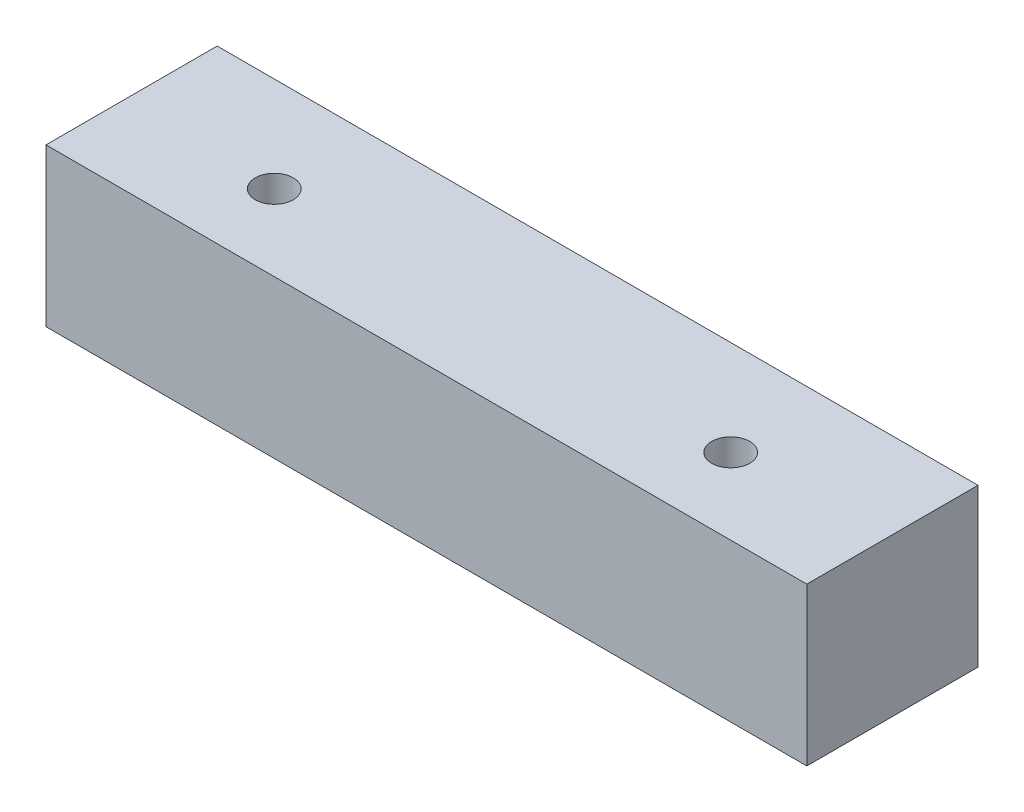
ISO-10303-21;
HEADER;
FILE_DESCRIPTION(('STEP AP214'),'2;1');
FILE_NAME('part.step','',(''),(''),'','','');
FILE_SCHEMA(('AUTOMOTIVE_DESIGN { 1 0 10303 214 1 1 1 1 }'));
ENDSEC;
DATA;
#1=APPLICATION_CONTEXT('core data for automotive mechanical design processes');
#2=APPLICATION_PROTOCOL_DEFINITION('international standard','automotive_design',2000,#1);
#3=PRODUCT_CONTEXT('',#1,'mechanical');
#4=PRODUCT('Part','Part','',(#3));
#5=PRODUCT_RELATED_PRODUCT_CATEGORY('part','',(#4));
#6=PRODUCT_DEFINITION_FORMATION('','',#4);
#7=PRODUCT_DEFINITION_CONTEXT('part definition',#1,'design');
#8=PRODUCT_DEFINITION('design','',#6,#7);
#9=PRODUCT_DEFINITION_SHAPE('','',#8);
#10=(LENGTH_UNIT() NAMED_UNIT(*) SI_UNIT(.MILLI.,.METRE.));
#11=(NAMED_UNIT(*) PLANE_ANGLE_UNIT() SI_UNIT($,.RADIAN.));
#12=(NAMED_UNIT(*) SI_UNIT($,.STERADIAN.) SOLID_ANGLE_UNIT());
#13=UNCERTAINTY_MEASURE_WITH_UNIT(LENGTH_MEASURE(1.E-05),#10,'distance_accuracy_value','');
#14=(GEOMETRIC_REPRESENTATION_CONTEXT(3) GLOBAL_UNCERTAINTY_ASSIGNED_CONTEXT((#13)) GLOBAL_UNIT_ASSIGNED_CONTEXT((#10,
#11,#12)) REPRESENTATION_CONTEXT('',''));
#15=CARTESIAN_POINT('',(0.,0.,0.));
#16=DIRECTION('',(0.,0.,1.));
#17=DIRECTION('',(1.,0.,0.));
#18=AXIS2_PLACEMENT_3D('',#15,#16,#17);
#19=CARTESIAN_POINT('',(8.,4.78,-5.2));
#20=DIRECTION('',(0.,0.,-1.));
#21=DIRECTION('',(-1.,0.,0.));
#22=AXIS2_PLACEMENT_3D('',#19,#20,#21);
#23=PLANE('',#22);
#24=DIRECTION('',(1.,0.,0.));
#25=VECTOR('',#24,1.);
#26=CARTESIAN_POINT('',(9.75,5.03,-5.2));
#27=LINE('',#26,#25);
#28=CARTESIAN_POINT('',(6.26794919243112,5.03,-5.2));
#29=VERTEX_POINT('',#28);
#30=CARTESIAN_POINT('',(9.73205080756888,5.03,-5.2));
#31=VERTEX_POINT('',#30);
#32=EDGE_CURVE('E216',#29,#31,#27,.T.);
#33=ORIENTED_EDGE('',*,*,#32,.F.);
#34=CARTESIAN_POINT('',(8.,4.78,-5.2));
#35=DIRECTION('',(0.,0.,-1.));
#36=DIRECTION('',(-1.,0.,0.));
#37=AXIS2_PLACEMENT_3D('',#34,#35,#36);
#38=CIRCLE('',#37,1.75);
#39=EDGE_CURVE('E301',#29,#31,#38,.T.);
#40=ORIENTED_EDGE('',*,*,#39,.T.);
#41=EDGE_LOOP('',(#33,#40));
#42=FACE_BOUND('',#41,.T.);
#43=ADVANCED_FACE('F43',(#42),#23,.T.);
#44=CARTESIAN_POINT('',(32.,4.78,-5.2));
#45=DIRECTION('',(0.,0.,-1.));
#46=DIRECTION('',(-1.,0.,0.));
#47=AXIS2_PLACEMENT_3D('',#44,#45,#46);
#48=PLANE('',#47);
#49=DIRECTION('',(-1.,0.,0.));
#50=VECTOR('',#49,1.);
#51=CARTESIAN_POINT('',(34.25,4.53,-5.2));
#52=LINE('',#51,#50);
#53=CARTESIAN_POINT('',(33.7320508075689,4.53,-5.2));
#54=VERTEX_POINT('',#53);
#55=CARTESIAN_POINT('',(30.2679491924311,4.53,-5.2));
#56=VERTEX_POINT('',#55);
#57=EDGE_CURVE('E264',#54,#56,#52,.T.);
#58=ORIENTED_EDGE('',*,*,#57,.F.);
#59=CARTESIAN_POINT('',(32.,4.78,-5.2));
#60=DIRECTION('',(0.,0.,-1.));
#61=DIRECTION('',(-1.,0.,0.));
#62=AXIS2_PLACEMENT_3D('',#59,#60,#61);
#63=CIRCLE('',#62,1.75);
#64=EDGE_CURVE('E434',#54,#56,#63,.T.);
#65=ORIENTED_EDGE('',*,*,#64,.T.);
#66=EDGE_LOOP('',(#58,#65));
#67=FACE_BOUND('',#66,.T.);
#68=ADVANCED_FACE('F491',(#67),#48,.T.);
#69=CARTESIAN_POINT('',(8.,-1.72,-4.));
#70=DIRECTION('',(0.,1.,0.));
#71=DIRECTION('',(0.,0.,1.));
#72=AXIS2_PLACEMENT_3D('',#69,#70,#71);
#73=CYLINDRICAL_SURFACE('',#72,1.);
#74=CARTESIAN_POINT('',(8.,5.03,-4.));
#75=DIRECTION('',(0.,1.,0.));
#76=DIRECTION('',(0.,0.,1.));
#77=AXIS2_PLACEMENT_3D('',#74,#75,#76);
#78=CIRCLE('',#77,1.);
#79=CARTESIAN_POINT('',(8.,5.03,-3.));
#80=VERTEX_POINT('',#79);
#81=EDGE_CURVE('E47',#80,#80,#78,.F.);
#82=ORIENTED_EDGE('',*,*,#81,.T.);
#83=EDGE_LOOP('',(#82));
#84=FACE_BOUND('',#83,.T.);
#85=CARTESIAN_POINT('',(8.,8.28,-4.));
#86=DIRECTION('',(0.,-1.,0.));
#87=DIRECTION('',(0.,0.,-1.));
#88=AXIS2_PLACEMENT_3D('',#85,#86,#87);
#89=CIRCLE('',#88,1.);
#90=CARTESIAN_POINT('',(8.,8.28,-5.));
#91=VERTEX_POINT('',#90);
#92=EDGE_CURVE('E303',#91,#91,#89,.T.);
#93=ORIENTED_EDGE('',*,*,#92,.F.);
#94=EDGE_LOOP('',(#93));
#95=FACE_BOUND('',#94,.T.);
#96=ADVANCED_FACE('F496',(#84,#95),#73,.F.);
#97=CARTESIAN_POINT('',(32.,-1.72,-4.));
#98=DIRECTION('',(0.,1.,0.));
#99=DIRECTION('',(0.,0.,1.));
#100=AXIS2_PLACEMENT_3D('',#97,#98,#99);
#101=CYLINDRICAL_SURFACE('',#100,0.999999999999998);
#102=CARTESIAN_POINT('',(32.,5.03,-4.));
#103=DIRECTION('',(0.,1.,0.));
#104=DIRECTION('',(0.,0.,1.));
#105=AXIS2_PLACEMENT_3D('',#102,#103,#104);
#106=CIRCLE('',#105,0.999999999999998);
#107=CARTESIAN_POINT('',(32.,5.03,-3.));
#108=VERTEX_POINT('',#107);
#109=EDGE_CURVE('E358',#108,#108,#106,.F.);
#110=ORIENTED_EDGE('',*,*,#109,.T.);
#111=EDGE_LOOP('',(#110));
#112=FACE_BOUND('',#111,.T.);
#113=CARTESIAN_POINT('',(32.,8.28,-4.));
#114=DIRECTION('',(0.,-1.,0.));
#115=DIRECTION('',(0.,0.,-1.));
#116=AXIS2_PLACEMENT_3D('',#113,#114,#115);
#117=CIRCLE('',#116,0.999999999999998);
#118=CARTESIAN_POINT('',(32.,8.28,-5.));
#119=VERTEX_POINT('',#118);
#120=EDGE_CURVE('E308',#119,#119,#117,.T.);
#121=ORIENTED_EDGE('',*,*,#120,.F.);
#122=EDGE_LOOP('',(#121));
#123=FACE_BOUND('',#122,.T.);
#124=ADVANCED_FACE('F489',(#112,#123),#101,.F.);
#125=CARTESIAN_POINT('',(0.,8.28,0.));
#126=DIRECTION('',(0.,0.,-1.));
#127=DIRECTION('',(-1.,0.,0.));
#128=AXIS2_PLACEMENT_3D('',#125,#126,#127);
#129=PLANE('',#128);
#130=DIRECTION('',(1.,0.,0.));
#131=VECTOR('',#130,1.);
#132=CARTESIAN_POINT('',(0.,0.,0.));
#133=LINE('',#132,#131);
#134=CARTESIAN_POINT('',(0.,0.,0.));
#135=VERTEX_POINT('',#134);
#136=CARTESIAN_POINT('',(40.,0.,0.));
#137=VERTEX_POINT('',#136);
#138=EDGE_CURVE('E312',#135,#137,#133,.T.);
#139=ORIENTED_EDGE('',*,*,#138,.T.);
#140=DIRECTION('',(0.,-1.,0.));
#141=VECTOR('',#140,1.);
#142=CARTESIAN_POINT('',(40.,8.28,0.));
#143=LINE('',#142,#141);
#144=CARTESIAN_POINT('',(40.,8.28,0.));
#145=VERTEX_POINT('',#144);
#146=EDGE_CURVE('E11',#145,#137,#143,.T.);
#147=ORIENTED_EDGE('',*,*,#146,.F.);
#148=DIRECTION('',(1.,0.,0.));
#149=VECTOR('',#148,1.);
#150=CARTESIAN_POINT('',(0.,8.28,0.));
#151=LINE('',#150,#149);
#152=CARTESIAN_POINT('',(0.,8.28,0.));
#153=VERTEX_POINT('',#152);
#154=EDGE_CURVE('E313',#153,#145,#151,.T.);
#155=ORIENTED_EDGE('',*,*,#154,.F.);
#156=DIRECTION('',(0.,-1.,0.));
#157=VECTOR('',#156,1.);
#158=CARTESIAN_POINT('',(0.,8.28,0.));
#159=LINE('',#158,#157);
#160=EDGE_CURVE('E327',#153,#135,#159,.T.);
#161=ORIENTED_EDGE('',*,*,#160,.T.);
#162=EDGE_LOOP('',(#139,#147,#155,#161));
#163=FACE_BOUND('',#162,.T.);
#164=ADVANCED_FACE('F45',(#163),#129,.F.);
#165=CARTESIAN_POINT('',(40.,8.28,-9.));
#166=DIRECTION('',(-1.,0.,0.));
#167=DIRECTION('',(0.,0.,1.));
#168=AXIS2_PLACEMENT_3D('',#165,#166,#167);
#169=PLANE('',#168);
#170=DIRECTION('',(0.,0.,-1.));
#171=VECTOR('',#170,1.);
#172=CARTESIAN_POINT('',(40.,0.,-9.));
#173=LINE('',#172,#171);
#174=CARTESIAN_POINT('',(40.,0.,-9.));
#175=VERTEX_POINT('',#174);
#176=EDGE_CURVE('E331',#137,#175,#173,.T.);
#177=ORIENTED_EDGE('',*,*,#176,.T.);
#178=DIRECTION('',(0.,-1.,0.));
#179=VECTOR('',#178,1.);
#180=CARTESIAN_POINT('',(40.,8.28,-9.));
#181=LINE('',#180,#179);
#182=CARTESIAN_POINT('',(40.,8.28,-9.));
#183=VERTEX_POINT('',#182);
#184=EDGE_CURVE('E53',#183,#175,#181,.T.);
#185=ORIENTED_EDGE('',*,*,#184,.F.);
#186=DIRECTION('',(0.,0.,-1.));
#187=VECTOR('',#186,1.);
#188=CARTESIAN_POINT('',(40.,8.28,-9.));
#189=LINE('',#188,#187);
#190=EDGE_CURVE('E317',#145,#183,#189,.T.);
#191=ORIENTED_EDGE('',*,*,#190,.F.);
#192=ORIENTED_EDGE('',*,*,#146,.T.);
#193=EDGE_LOOP('',(#177,#185,#191,#192));
#194=FACE_BOUND('',#193,.T.);
#195=ADVANCED_FACE('F464',(#194),#169,.F.);
#196=CARTESIAN_POINT('',(0.,8.28,-9.));
#197=DIRECTION('',(0.,0.,1.));
#198=DIRECTION('',(1.,0.,0.));
#199=AXIS2_PLACEMENT_3D('',#196,#197,#198);
#200=PLANE('',#199);
#201=CARTESIAN_POINT('',(32.,4.78,-9.));
#202=DIRECTION('',(0.,0.,-1.));
#203=DIRECTION('',(-1.,0.,0.));
#204=AXIS2_PLACEMENT_3D('',#201,#202,#203);
#205=CIRCLE('',#204,1.75);
#206=CARTESIAN_POINT('',(30.25,4.78,-9.));
#207=VERTEX_POINT('',#206);
#208=EDGE_CURVE('E290',#207,#207,#205,.T.);
#209=ORIENTED_EDGE('',*,*,#208,.F.);
#210=EDGE_LOOP('',(#209));
#211=FACE_BOUND('',#210,.T.);
#212=CARTESIAN_POINT('',(8.,4.78,-9.));
#213=DIRECTION('',(0.,0.,-1.));
#214=DIRECTION('',(-1.,0.,0.));
#215=AXIS2_PLACEMENT_3D('',#212,#213,#214);
#216=CIRCLE('',#215,1.75);
#217=CARTESIAN_POINT('',(6.25,4.78,-9.));
#218=VERTEX_POINT('',#217);
#219=EDGE_CURVE('E294',#218,#218,#216,.T.);
#220=ORIENTED_EDGE('',*,*,#219,.F.);
#221=EDGE_LOOP('',(#220));
#222=FACE_BOUND('',#221,.T.);
#223=DIRECTION('',(-1.,0.,0.));
#224=VECTOR('',#223,1.);
#225=CARTESIAN_POINT('',(0.,0.,-9.));
#226=LINE('',#225,#224);
#227=CARTESIAN_POINT('',(0.,0.,-9.));
#228=VERTEX_POINT('',#227);
#229=EDGE_CURVE('E334',#175,#228,#226,.T.);
#230=ORIENTED_EDGE('',*,*,#229,.T.);
#231=DIRECTION('',(0.,-1.,0.));
#232=VECTOR('',#231,1.);
#233=CARTESIAN_POINT('',(0.,8.28,-9.));
#234=LINE('',#233,#232);
#235=CARTESIAN_POINT('',(0.,8.28,-9.));
#236=VERTEX_POINT('',#235);
#237=EDGE_CURVE('E342',#236,#228,#234,.T.);
#238=ORIENTED_EDGE('',*,*,#237,.F.);
#239=DIRECTION('',(-1.,0.,0.));
#240=VECTOR('',#239,1.);
#241=CARTESIAN_POINT('',(0.,8.28,-9.));
#242=LINE('',#241,#240);
#243=EDGE_CURVE('E321',#183,#236,#242,.T.);
#244=ORIENTED_EDGE('',*,*,#243,.F.);
#245=ORIENTED_EDGE('',*,*,#184,.T.);
#246=EDGE_LOOP('',(#230,#238,#244,#245));
#247=FACE_BOUND('',#246,.T.);
#248=ADVANCED_FACE('F460',(#211,#222,#247),#200,.F.);
#249=CARTESIAN_POINT('',(0.,8.28,0.));
#250=DIRECTION('',(1.,0.,0.));
#251=DIRECTION('',(0.,0.,-1.));
#252=AXIS2_PLACEMENT_3D('',#249,#250,#251);
#253=PLANE('',#252);
#254=DIRECTION('',(0.,0.,1.));
#255=VECTOR('',#254,1.);
#256=CARTESIAN_POINT('',(0.,0.,0.));
#257=LINE('',#256,#255);
#258=EDGE_CURVE('E318',#228,#135,#257,.T.);
#259=ORIENTED_EDGE('',*,*,#258,.T.);
#260=ORIENTED_EDGE('',*,*,#160,.F.);
#261=DIRECTION('',(0.,0.,1.));
#262=VECTOR('',#261,1.);
#263=CARTESIAN_POINT('',(0.,8.28,0.));
#264=LINE('',#263,#262);
#265=EDGE_CURVE('E324',#236,#153,#264,.T.);
#266=ORIENTED_EDGE('',*,*,#265,.F.);
#267=ORIENTED_EDGE('',*,*,#237,.T.);
#268=EDGE_LOOP('',(#259,#260,#266,#267));
#269=FACE_BOUND('',#268,.T.);
#270=ADVANCED_FACE('F463',(#269),#253,.F.);
#271=CARTESIAN_POINT('',(0.,8.28,0.));
#272=DIRECTION('',(0.,-1.,0.));
#273=DIRECTION('',(0.,0.,-1.));
#274=AXIS2_PLACEMENT_3D('',#271,#272,#273);
#275=PLANE('',#274);
#276=ORIENTED_EDGE('',*,*,#120,.T.);
#277=EDGE_LOOP('',(#276));
#278=FACE_BOUND('',#277,.T.);
#279=ORIENTED_EDGE('',*,*,#92,.T.);
#280=EDGE_LOOP('',(#279));
#281=FACE_BOUND('',#280,.T.);
#282=ORIENTED_EDGE('',*,*,#154,.T.);
#283=ORIENTED_EDGE('',*,*,#190,.T.);
#284=ORIENTED_EDGE('',*,*,#243,.T.);
#285=ORIENTED_EDGE('',*,*,#265,.T.);
#286=EDGE_LOOP('',(#282,#283,#284,#285));
#287=FACE_BOUND('',#286,.T.);
#288=ADVANCED_FACE('F483',(#278,#281,#287),#275,.F.);
#289=CARTESIAN_POINT('',(0.,0.,0.));
#290=DIRECTION('',(0.,-1.,0.));
#291=DIRECTION('',(0.,0.,-1.));
#292=AXIS2_PLACEMENT_3D('',#289,#290,#291);
#293=PLANE('',#292);
#294=CARTESIAN_POINT('',(32.,0.,-4.));
#295=DIRECTION('',(0.,-1.,0.));
#296=DIRECTION('',(0.,0.,-1.));
#297=AXIS2_PLACEMENT_3D('',#294,#295,#296);
#298=CIRCLE('',#297,0.999999999999998);
#299=CARTESIAN_POINT('',(32.,0.,-5.));
#300=VERTEX_POINT('',#299);
#301=EDGE_CURVE('E307',#300,#300,#298,.T.);
#302=ORIENTED_EDGE('',*,*,#301,.F.);
#303=EDGE_LOOP('',(#302));
#304=FACE_BOUND('',#303,.T.);
#305=CARTESIAN_POINT('',(8.,0.,-4.));
#306=DIRECTION('',(0.,-1.,0.));
#307=DIRECTION('',(0.,0.,-1.));
#308=AXIS2_PLACEMENT_3D('',#305,#306,#307);
#309=CIRCLE('',#308,1.);
#310=CARTESIAN_POINT('',(8.,0.,-5.));
#311=VERTEX_POINT('',#310);
#312=EDGE_CURVE('E287',#311,#311,#309,.T.);
#313=ORIENTED_EDGE('',*,*,#312,.F.);
#314=EDGE_LOOP('',(#313));
#315=FACE_BOUND('',#314,.T.);
#316=ORIENTED_EDGE('',*,*,#138,.F.);
#317=ORIENTED_EDGE('',*,*,#258,.F.);
#318=ORIENTED_EDGE('',*,*,#229,.F.);
#319=ORIENTED_EDGE('',*,*,#176,.F.);
#320=EDGE_LOOP('',(#316,#317,#318,#319));
#321=FACE_BOUND('',#320,.T.);
#322=ADVANCED_FACE('F478',(#304,#315,#321),#293,.T.);
#323=CARTESIAN_POINT('',(8.,4.53,-4.));
#324=DIRECTION('',(0.,-1.,0.));
#325=DIRECTION('',(0.,0.,-1.));
#326=AXIS2_PLACEMENT_3D('',#323,#324,#325);
#327=CIRCLE('',#326,1.);
#328=CARTESIAN_POINT('',(8.,4.53,-5.));
#329=VERTEX_POINT('',#328);
#330=EDGE_CURVE('E361',#329,#329,#327,.F.);
#331=ORIENTED_EDGE('',*,*,#330,.T.);
#332=EDGE_LOOP('',(#331));
#333=FACE_BOUND('',#332,.T.);
#334=ORIENTED_EDGE('',*,*,#312,.T.);
#335=EDGE_LOOP('',(#334));
#336=FACE_BOUND('',#335,.T.);
#337=ADVANCED_FACE('F612',(#333,#336),#73,.F.);
#338=CARTESIAN_POINT('',(32.,4.53,-4.));
#339=DIRECTION('',(0.,-1.,0.));
#340=DIRECTION('',(0.,0.,-1.));
#341=AXIS2_PLACEMENT_3D('',#338,#339,#340);
#342=CIRCLE('',#341,0.999999999999998);
#343=CARTESIAN_POINT('',(32.,4.53,-5.));
#344=VERTEX_POINT('',#343);
#345=EDGE_CURVE('E227',#344,#344,#342,.F.);
#346=ORIENTED_EDGE('',*,*,#345,.T.);
#347=EDGE_LOOP('',(#346));
#348=FACE_BOUND('',#347,.T.);
#349=ORIENTED_EDGE('',*,*,#301,.T.);
#350=EDGE_LOOP('',(#349));
#351=FACE_BOUND('',#350,.T.);
#352=ADVANCED_FACE('F504',(#348,#351),#101,.F.);
#353=CARTESIAN_POINT('',(8.,4.78,-5.2));
#354=DIRECTION('',(0.,0.,-1.));
#355=DIRECTION('',(-1.,0.,0.));
#356=AXIS2_PLACEMENT_3D('',#353,#354,#355);
#357=CYLINDRICAL_SURFACE('',#356,1.75);
#358=CARTESIAN_POINT('',(6.25,4.78,-5.2));
#359=VERTEX_POINT('',#358);
#360=EDGE_CURVE('E298',#359,#29,#38,.T.);
#361=ORIENTED_EDGE('',*,*,#360,.F.);
#362=CARTESIAN_POINT('',(6.26794919243112,4.53,-5.2));
#363=VERTEX_POINT('',#362);
#364=EDGE_CURVE('E302',#363,#359,#38,.T.);
#365=ORIENTED_EDGE('',*,*,#364,.F.);
#366=CARTESIAN_POINT('',(9.73205080756888,4.53,-5.2));
#367=VERTEX_POINT('',#366);
#368=EDGE_CURVE('E371',#367,#363,#38,.T.);
#369=ORIENTED_EDGE('',*,*,#368,.F.);
#370=CARTESIAN_POINT('',(9.75,4.78,-5.2));
#371=VERTEX_POINT('',#370);
#372=EDGE_CURVE('E378',#371,#367,#38,.T.);
#373=ORIENTED_EDGE('',*,*,#372,.F.);
#374=EDGE_CURVE('E383',#31,#371,#38,.T.);
#375=ORIENTED_EDGE('',*,*,#374,.F.);
#376=ORIENTED_EDGE('',*,*,#39,.F.);
#377=EDGE_LOOP('',(#361,#365,#369,#373,#375,#376));
#378=FACE_BOUND('',#377,.T.);
#379=ORIENTED_EDGE('',*,*,#219,.T.);
#380=EDGE_LOOP('',(#379));
#381=FACE_BOUND('',#380,.T.);
#382=ADVANCED_FACE('F397',(#378,#381),#357,.F.);
#383=DIRECTION('',(-1.,0.,0.));
#384=VECTOR('',#383,1.);
#385=CARTESIAN_POINT('',(6.25,4.53,-5.2));
#386=LINE('',#385,#384);
#387=EDGE_CURVE('E222',#367,#363,#386,.T.);
#388=ORIENTED_EDGE('',*,*,#387,.F.);
#389=ORIENTED_EDGE('',*,*,#368,.T.);
#390=EDGE_LOOP('',(#388,#389));
#391=FACE_BOUND('',#390,.T.);
#392=ADVANCED_FACE('F456',(#391),#23,.T.);
#393=CARTESIAN_POINT('',(32.,4.78,-5.2));
#394=DIRECTION('',(0.,0.,-1.));
#395=DIRECTION('',(-1.,0.,0.));
#396=AXIS2_PLACEMENT_3D('',#393,#394,#395);
#397=CYLINDRICAL_SURFACE('',#396,1.75);
#398=CARTESIAN_POINT('',(30.25,4.78,-5.2));
#399=VERTEX_POINT('',#398);
#400=CARTESIAN_POINT('',(30.2679491924311,5.03,-5.2));
#401=VERTEX_POINT('',#400);
#402=EDGE_CURVE('E284',#399,#401,#63,.T.);
#403=ORIENTED_EDGE('',*,*,#402,.F.);
#404=EDGE_CURVE('E289',#56,#399,#63,.T.);
#405=ORIENTED_EDGE('',*,*,#404,.F.);
#406=ORIENTED_EDGE('',*,*,#64,.F.);
#407=CARTESIAN_POINT('',(33.75,4.78,-5.2));
#408=VERTEX_POINT('',#407);
#409=EDGE_CURVE('E432',#408,#54,#63,.T.);
#410=ORIENTED_EDGE('',*,*,#409,.F.);
#411=EDGE_CURVE('E288',#401,#408,#63,.T.);
#412=ORIENTED_EDGE('',*,*,#411,.F.);
#413=EDGE_LOOP('',(#403,#405,#406,#410,#412));
#414=FACE_BOUND('',#413,.T.);
#415=ORIENTED_EDGE('',*,*,#208,.T.);
#416=EDGE_LOOP('',(#415));
#417=FACE_BOUND('',#416,.T.);
#418=ADVANCED_FACE('F453',(#414,#417),#397,.F.);
#419=DIRECTION('',(0.894427190999916,-0.447213595499958,0.));
#420=VECTOR('',#419,1.);
#421=CARTESIAN_POINT('',(34.25,4.53,-5.2));
#422=LINE('',#421,#420);
#423=CARTESIAN_POINT('',(33.25,5.03,-5.2));
#424=VERTEX_POINT('',#423);
#425=EDGE_CURVE('E265',#424,#408,#422,.T.);
#426=ORIENTED_EDGE('',*,*,#425,.F.);
#427=DIRECTION('',(1.,0.,0.));
#428=VECTOR('',#427,1.);
#429=CARTESIAN_POINT('',(30.25,5.03,-5.2));
#430=LINE('',#429,#428);
#431=EDGE_CURVE('E253',#401,#424,#430,.T.);
#432=ORIENTED_EDGE('',*,*,#431,.F.);
#433=ORIENTED_EDGE('',*,*,#411,.T.);
#434=EDGE_LOOP('',(#426,#432,#433));
#435=FACE_BOUND('',#434,.T.);
#436=ADVANCED_FACE('F428',(#435),#48,.T.);
#437=CARTESIAN_POINT('',(0.,0.,-5.2));
#438=DIRECTION('',(0.,0.,-1.));
#439=DIRECTION('',(-1.,0.,0.));
#440=AXIS2_PLACEMENT_3D('',#437,#438,#439);
#441=PLANE('',#440);
#442=ORIENTED_EDGE('',*,*,#409,.T.);
#443=CARTESIAN_POINT('',(34.25,4.53,-5.2));
#444=VERTEX_POINT('',#443);
#445=EDGE_CURVE('E259',#444,#54,#52,.T.);
#446=ORIENTED_EDGE('',*,*,#445,.F.);
#447=EDGE_CURVE('E263',#408,#444,#422,.T.);
#448=ORIENTED_EDGE('',*,*,#447,.F.);
#449=EDGE_LOOP('',(#442,#446,#448));
#450=FACE_BOUND('',#449,.T.);
#451=ADVANCED_FACE('F538',(#450),#441,.F.);
#452=ORIENTED_EDGE('',*,*,#402,.T.);
#453=CARTESIAN_POINT('',(30.25,5.03,-5.2));
#454=VERTEX_POINT('',#453);
#455=EDGE_CURVE('E69',#454,#401,#430,.T.);
#456=ORIENTED_EDGE('',*,*,#455,.F.);
#457=DIRECTION('',(0.,1.,0.));
#458=VECTOR('',#457,1.);
#459=CARTESIAN_POINT('',(30.25,4.53,-5.2));
#460=LINE('',#459,#458);
#461=EDGE_CURVE('E252',#399,#454,#460,.T.);
#462=ORIENTED_EDGE('',*,*,#461,.F.);
#463=EDGE_LOOP('',(#452,#456,#462));
#464=FACE_BOUND('',#463,.T.);
#465=ADVANCED_FACE('F449',(#464),#441,.F.);
#466=CARTESIAN_POINT('',(30.25,5.03,-2.7));
#467=DIRECTION('',(0.,1.,0.));
#468=DIRECTION('',(0.,0.,1.));
#469=AXIS2_PLACEMENT_3D('',#466,#467,#468);
#470=PLANE('',#469);
#471=ORIENTED_EDGE('',*,*,#455,.T.);
#472=ORIENTED_EDGE('',*,*,#431,.T.);
#473=DIRECTION('',(0.,0.,-1.));
#474=VECTOR('',#473,1.);
#475=CARTESIAN_POINT('',(33.25,5.03,-2.7));
#476=LINE('',#475,#474);
#477=CARTESIAN_POINT('',(33.25,5.03,-2.7));
#478=VERTEX_POINT('',#477);
#479=EDGE_CURVE('E246',#478,#424,#476,.T.);
#480=ORIENTED_EDGE('',*,*,#479,.F.);
#481=DIRECTION('',(1.,0.,0.));
#482=VECTOR('',#481,1.);
#483=CARTESIAN_POINT('',(30.25,5.03,-2.7));
#484=LINE('',#483,#482);
#485=CARTESIAN_POINT('',(30.25,5.03,-2.7));
#486=VERTEX_POINT('',#485);
#487=EDGE_CURVE('E238',#486,#478,#484,.T.);
#488=ORIENTED_EDGE('',*,*,#487,.F.);
#489=DIRECTION('',(0.,0.,-1.));
#490=VECTOR('',#489,1.);
#491=CARTESIAN_POINT('',(30.25,5.03,-2.7));
#492=LINE('',#491,#490);
#493=EDGE_CURVE('E243',#486,#454,#492,.T.);
#494=ORIENTED_EDGE('',*,*,#493,.T.);
#495=EDGE_LOOP('',(#471,#472,#480,#488,#494));
#496=FACE_BOUND('',#495,.T.);
#497=ORIENTED_EDGE('',*,*,#109,.F.);
#498=EDGE_LOOP('',(#497));
#499=FACE_BOUND('',#498,.T.);
#500=ADVANCED_FACE('F417',(#496,#499),#470,.F.);
#501=CARTESIAN_POINT('',(34.25,4.53,-2.7));
#502=DIRECTION('',(0.,-1.,0.));
#503=DIRECTION('',(0.,0.,-1.));
#504=AXIS2_PLACEMENT_3D('',#501,#502,#503);
#505=PLANE('',#504);
#506=ORIENTED_EDGE('',*,*,#445,.T.);
#507=ORIENTED_EDGE('',*,*,#57,.T.);
#508=CARTESIAN_POINT('',(30.25,4.53,-5.2));
#509=VERTEX_POINT('',#508);
#510=EDGE_CURVE('E258',#56,#509,#52,.T.);
#511=ORIENTED_EDGE('',*,*,#510,.T.);
#512=DIRECTION('',(0.,0.,-1.));
#513=VECTOR('',#512,1.);
#514=CARTESIAN_POINT('',(30.25,4.53,-2.7));
#515=LINE('',#514,#513);
#516=CARTESIAN_POINT('',(30.25,4.53,-2.7));
#517=VERTEX_POINT('',#516);
#518=EDGE_CURVE('E239',#517,#509,#515,.T.);
#519=ORIENTED_EDGE('',*,*,#518,.F.);
#520=DIRECTION('',(-1.,0.,0.));
#521=VECTOR('',#520,1.);
#522=CARTESIAN_POINT('',(34.25,4.53,-2.7));
#523=LINE('',#522,#521);
#524=CARTESIAN_POINT('',(34.25,4.53,-2.7));
#525=VERTEX_POINT('',#524);
#526=EDGE_CURVE('E276',#525,#517,#523,.T.);
#527=ORIENTED_EDGE('',*,*,#526,.F.);
#528=DIRECTION('',(0.,0.,-1.));
#529=VECTOR('',#528,1.);
#530=CARTESIAN_POINT('',(34.25,4.53,-2.7));
#531=LINE('',#530,#529);
#532=EDGE_CURVE('E234',#525,#444,#531,.T.);
#533=ORIENTED_EDGE('',*,*,#532,.T.);
#534=EDGE_LOOP('',(#506,#507,#511,#519,#527,#533));
#535=FACE_BOUND('',#534,.T.);
#536=ORIENTED_EDGE('',*,*,#345,.F.);
#537=EDGE_LOOP('',(#536));
#538=FACE_BOUND('',#537,.T.);
#539=ADVANCED_FACE('F557',(#535,#538),#505,.F.);
#540=CARTESIAN_POINT('',(34.25,4.53,-2.7));
#541=DIRECTION('',(0.447213595499958,0.894427190999916,0.));
#542=DIRECTION('',(-0.894427190999916,0.447213595499958,0.));
#543=AXIS2_PLACEMENT_3D('',#540,#541,#542);
#544=PLANE('',#543);
#545=ORIENTED_EDGE('',*,*,#425,.T.);
#546=ORIENTED_EDGE('',*,*,#447,.T.);
#547=ORIENTED_EDGE('',*,*,#532,.F.);
#548=DIRECTION('',(0.894427190999916,-0.447213595499958,0.));
#549=VECTOR('',#548,1.);
#550=CARTESIAN_POINT('',(34.25,4.53,-2.7));
#551=LINE('',#550,#549);
#552=EDGE_CURVE('E280',#478,#525,#551,.T.);
#553=ORIENTED_EDGE('',*,*,#552,.F.);
#554=ORIENTED_EDGE('',*,*,#479,.T.);
#555=EDGE_LOOP('',(#545,#546,#547,#553,#554));
#556=FACE_BOUND('',#555,.T.);
#557=ADVANCED_FACE('F426',(#556),#544,.F.);
#558=CARTESIAN_POINT('',(30.25,4.53,-2.7));
#559=DIRECTION('',(-1.,0.,0.));
#560=DIRECTION('',(0.,0.,1.));
#561=AXIS2_PLACEMENT_3D('',#558,#559,#560);
#562=PLANE('',#561);
#563=EDGE_CURVE('E254',#509,#399,#460,.T.);
#564=ORIENTED_EDGE('',*,*,#563,.T.);
#565=ORIENTED_EDGE('',*,*,#461,.T.);
#566=ORIENTED_EDGE('',*,*,#493,.F.);
#567=DIRECTION('',(0.,1.,0.));
#568=VECTOR('',#567,1.);
#569=CARTESIAN_POINT('',(30.25,4.53,-2.7));
#570=LINE('',#569,#568);
#571=EDGE_CURVE('E272',#517,#486,#570,.T.);
#572=ORIENTED_EDGE('',*,*,#571,.F.);
#573=ORIENTED_EDGE('',*,*,#518,.T.);
#574=EDGE_LOOP('',(#564,#565,#566,#572,#573));
#575=FACE_BOUND('',#574,.T.);
#576=ADVANCED_FACE('F451',(#575),#562,.F.);
#577=CARTESIAN_POINT('',(0.,0.,-2.7));
#578=DIRECTION('',(0.,0.,-1.));
#579=DIRECTION('',(-1.,0.,0.));
#580=AXIS2_PLACEMENT_3D('',#577,#578,#579);
#581=PLANE('',#580);
#582=ORIENTED_EDGE('',*,*,#552,.T.);
#583=ORIENTED_EDGE('',*,*,#526,.T.);
#584=ORIENTED_EDGE('',*,*,#571,.T.);
#585=ORIENTED_EDGE('',*,*,#487,.T.);
#586=EDGE_LOOP('',(#582,#583,#584,#585));
#587=FACE_BOUND('',#586,.T.);
#588=ADVANCED_FACE('F536',(#587),#581,.T.);
#589=ORIENTED_EDGE('',*,*,#404,.T.);
#590=ORIENTED_EDGE('',*,*,#563,.F.);
#591=ORIENTED_EDGE('',*,*,#510,.F.);
#592=EDGE_LOOP('',(#589,#590,#591));
#593=FACE_BOUND('',#592,.T.);
#594=ADVANCED_FACE('F447',(#593),#441,.F.);
#595=CARTESIAN_POINT('',(0.,0.,-5.2));
#596=DIRECTION('',(0.,0.,-1.));
#597=DIRECTION('',(-1.,0.,0.));
#598=AXIS2_PLACEMENT_3D('',#595,#596,#597);
#599=PLANE('',#598);
#600=ORIENTED_EDGE('',*,*,#374,.T.);
#601=DIRECTION('',(0.,-1.,0.));
#602=VECTOR('',#601,1.);
#603=CARTESIAN_POINT('',(9.75,4.53,-5.2));
#604=LINE('',#603,#602);
#605=CARTESIAN_POINT('',(9.75,5.03,-5.2));
#606=VERTEX_POINT('',#605);
#607=EDGE_CURVE('E217',#606,#371,#604,.T.);
#608=ORIENTED_EDGE('',*,*,#607,.F.);
#609=EDGE_CURVE('E181',#31,#606,#27,.T.);
#610=ORIENTED_EDGE('',*,*,#609,.F.);
#611=EDGE_LOOP('',(#600,#608,#610));
#612=FACE_BOUND('',#611,.T.);
#613=ADVANCED_FACE('F510',(#612),#599,.F.);
#614=ORIENTED_EDGE('',*,*,#372,.T.);
#615=CARTESIAN_POINT('',(9.75,4.53,-5.2));
#616=VERTEX_POINT('',#615);
#617=EDGE_CURVE('E61',#616,#367,#386,.T.);
#618=ORIENTED_EDGE('',*,*,#617,.F.);
#619=EDGE_CURVE('E215',#371,#616,#604,.T.);
#620=ORIENTED_EDGE('',*,*,#619,.F.);
#621=EDGE_LOOP('',(#614,#618,#620));
#622=FACE_BOUND('',#621,.T.);
#623=ADVANCED_FACE('F517',(#622),#599,.F.);
#624=ORIENTED_EDGE('',*,*,#360,.T.);
#625=CARTESIAN_POINT('',(6.25,5.03,-5.2));
#626=VERTEX_POINT('',#625);
#627=EDGE_CURVE('E212',#626,#29,#27,.T.);
#628=ORIENTED_EDGE('',*,*,#627,.F.);
#629=DIRECTION('',(0.,1.,0.));
#630=VECTOR('',#629,1.);
#631=CARTESIAN_POINT('',(6.25,4.53,-5.2));
#632=LINE('',#631,#630);
#633=EDGE_CURVE('E205',#359,#626,#632,.T.);
#634=ORIENTED_EDGE('',*,*,#633,.F.);
#635=EDGE_LOOP('',(#624,#628,#634));
#636=FACE_BOUND('',#635,.T.);
#637=ADVANCED_FACE('F401',(#636),#599,.F.);
#638=CARTESIAN_POINT('',(9.75,5.03,-2.7));
#639=DIRECTION('',(0.,1.,0.));
#640=DIRECTION('',(0.,0.,1.));
#641=AXIS2_PLACEMENT_3D('',#638,#639,#640);
#642=PLANE('',#641);
#643=ORIENTED_EDGE('',*,*,#627,.T.);
#644=ORIENTED_EDGE('',*,*,#32,.T.);
#645=ORIENTED_EDGE('',*,*,#609,.T.);
#646=DIRECTION('',(0.,0.,-1.));
#647=VECTOR('',#646,1.);
#648=CARTESIAN_POINT('',(9.75,5.03,-2.7));
#649=LINE('',#648,#647);
#650=CARTESIAN_POINT('',(9.75,5.03,-2.7));
#651=VERTEX_POINT('',#650);
#652=EDGE_CURVE('E171',#651,#606,#649,.T.);
#653=ORIENTED_EDGE('',*,*,#652,.F.);
#654=DIRECTION('',(1.,0.,0.));
#655=VECTOR('',#654,1.);
#656=CARTESIAN_POINT('',(9.75,5.03,-2.7));
#657=LINE('',#656,#655);
#658=CARTESIAN_POINT('',(6.25,5.03,-2.7));
#659=VERTEX_POINT('',#658);
#660=EDGE_CURVE('E178',#659,#651,#657,.T.);
#661=ORIENTED_EDGE('',*,*,#660,.F.);
#662=DIRECTION('',(0.,0.,-1.));
#663=VECTOR('',#662,1.);
#664=CARTESIAN_POINT('',(6.25,5.03,-2.7));
#665=LINE('',#664,#663);
#666=EDGE_CURVE('E224',#659,#626,#665,.T.);
#667=ORIENTED_EDGE('',*,*,#666,.T.);
#668=EDGE_LOOP('',(#643,#644,#645,#653,#661,#667));
#669=FACE_BOUND('',#668,.T.);
#670=ORIENTED_EDGE('',*,*,#81,.F.);
#671=EDGE_LOOP('',(#670));
#672=FACE_BOUND('',#671,.T.);
#673=ADVANCED_FACE('F174',(#669,#672),#642,.F.);
#674=CARTESIAN_POINT('',(6.25,4.53,-2.7));
#675=DIRECTION('',(0.,-1.,0.));
#676=DIRECTION('',(0.,0.,-1.));
#677=AXIS2_PLACEMENT_3D('',#674,#675,#676);
#678=PLANE('',#677);
#679=ORIENTED_EDGE('',*,*,#617,.T.);
#680=ORIENTED_EDGE('',*,*,#387,.T.);
#681=CARTESIAN_POINT('',(6.25,4.53,-5.2));
#682=VERTEX_POINT('',#681);
#683=EDGE_CURVE('E220',#363,#682,#386,.T.);
#684=ORIENTED_EDGE('',*,*,#683,.T.);
#685=DIRECTION('',(0.,0.,-1.));
#686=VECTOR('',#685,1.);
#687=CARTESIAN_POINT('',(6.25,4.53,-2.7));
#688=LINE('',#687,#686);
#689=CARTESIAN_POINT('',(6.25,4.53,-2.7));
#690=VERTEX_POINT('',#689);
#691=EDGE_CURVE('E228',#690,#682,#688,.T.);
#692=ORIENTED_EDGE('',*,*,#691,.F.);
#693=DIRECTION('',(-1.,0.,0.));
#694=VECTOR('',#693,1.);
#695=CARTESIAN_POINT('',(6.25,4.53,-2.7));
#696=LINE('',#695,#694);
#697=CARTESIAN_POINT('',(9.75,4.53,-2.7));
#698=VERTEX_POINT('',#697);
#699=EDGE_CURVE('E196',#698,#690,#696,.T.);
#700=ORIENTED_EDGE('',*,*,#699,.F.);
#701=DIRECTION('',(0.,0.,-1.));
#702=VECTOR('',#701,1.);
#703=CARTESIAN_POINT('',(9.75,4.53,-2.7));
#704=LINE('',#703,#702);
#705=EDGE_CURVE('E186',#698,#616,#704,.T.);
#706=ORIENTED_EDGE('',*,*,#705,.T.);
#707=EDGE_LOOP('',(#679,#680,#684,#692,#700,#706));
#708=FACE_BOUND('',#707,.T.);
#709=ORIENTED_EDGE('',*,*,#330,.F.);
#710=EDGE_LOOP('',(#709));
#711=FACE_BOUND('',#710,.T.);
#712=ADVANCED_FACE('F505',(#708,#711),#678,.F.);
#713=CARTESIAN_POINT('',(6.25,4.53,-2.7));
#714=DIRECTION('',(-1.,0.,0.));
#715=DIRECTION('',(0.,0.,1.));
#716=AXIS2_PLACEMENT_3D('',#713,#714,#715);
#717=PLANE('',#716);
#718=EDGE_CURVE('E201',#682,#359,#632,.T.);
#719=ORIENTED_EDGE('',*,*,#718,.T.);
#720=ORIENTED_EDGE('',*,*,#633,.T.);
#721=ORIENTED_EDGE('',*,*,#666,.F.);
#722=DIRECTION('',(0.,1.,0.));
#723=VECTOR('',#722,1.);
#724=CARTESIAN_POINT('',(6.25,4.53,-2.7));
#725=LINE('',#724,#723);
#726=EDGE_CURVE('E187',#690,#659,#725,.T.);
#727=ORIENTED_EDGE('',*,*,#726,.F.);
#728=ORIENTED_EDGE('',*,*,#691,.T.);
#729=EDGE_LOOP('',(#719,#720,#721,#727,#728));
#730=FACE_BOUND('',#729,.T.);
#731=ADVANCED_FACE('F403',(#730),#717,.F.);
#732=CARTESIAN_POINT('',(9.75,4.53,-2.7));
#733=DIRECTION('',(1.,0.,0.));
#734=DIRECTION('',(0.,0.,-1.));
#735=AXIS2_PLACEMENT_3D('',#732,#733,#734);
#736=PLANE('',#735);
#737=ORIENTED_EDGE('',*,*,#607,.T.);
#738=ORIENTED_EDGE('',*,*,#619,.T.);
#739=ORIENTED_EDGE('',*,*,#705,.F.);
#740=DIRECTION('',(0.,-1.,0.));
#741=VECTOR('',#740,1.);
#742=CARTESIAN_POINT('',(9.75,4.53,-2.7));
#743=LINE('',#742,#741);
#744=EDGE_CURVE('E190',#651,#698,#743,.T.);
#745=ORIENTED_EDGE('',*,*,#744,.F.);
#746=ORIENTED_EDGE('',*,*,#652,.T.);
#747=EDGE_LOOP('',(#737,#738,#739,#745,#746));
#748=FACE_BOUND('',#747,.T.);
#749=ADVANCED_FACE('F191',(#748),#736,.F.);
#750=CARTESIAN_POINT('',(0.,0.,-2.7));
#751=DIRECTION('',(0.,0.,-1.));
#752=DIRECTION('',(-1.,0.,0.));
#753=AXIS2_PLACEMENT_3D('',#750,#751,#752);
#754=PLANE('',#753);
#755=ORIENTED_EDGE('',*,*,#660,.T.);
#756=ORIENTED_EDGE('',*,*,#744,.T.);
#757=ORIENTED_EDGE('',*,*,#699,.T.);
#758=ORIENTED_EDGE('',*,*,#726,.T.);
#759=EDGE_LOOP('',(#755,#756,#757,#758));
#760=FACE_BOUND('',#759,.T.);
#761=ADVANCED_FACE('F198',(#760),#754,.T.);
#762=ORIENTED_EDGE('',*,*,#364,.T.);
#763=ORIENTED_EDGE('',*,*,#718,.F.);
#764=ORIENTED_EDGE('',*,*,#683,.F.);
#765=EDGE_LOOP('',(#762,#763,#764));
#766=FACE_BOUND('',#765,.T.);
#767=ADVANCED_FACE('F507',(#766),#599,.F.);
#768=CLOSED_SHELL('',(#43,#68,#96,#124,#164,#195,#248,#270,#288,#322,#337,#352,#382,#392,#418,
#436,#451,#465,#500,#539,#557,#576,#588,#594,#613,#623,#637,#673,#712,#731,#749,#761,#767));
#769=MANIFOLD_SOLID_BREP('B2',#768);
#770=ADVANCED_BREP_SHAPE_REPRESENTATION('',(#18,#769),#14);
#771=SHAPE_DEFINITION_REPRESENTATION(#9,#770);
ENDSEC;
END-ISO-10303-21;
